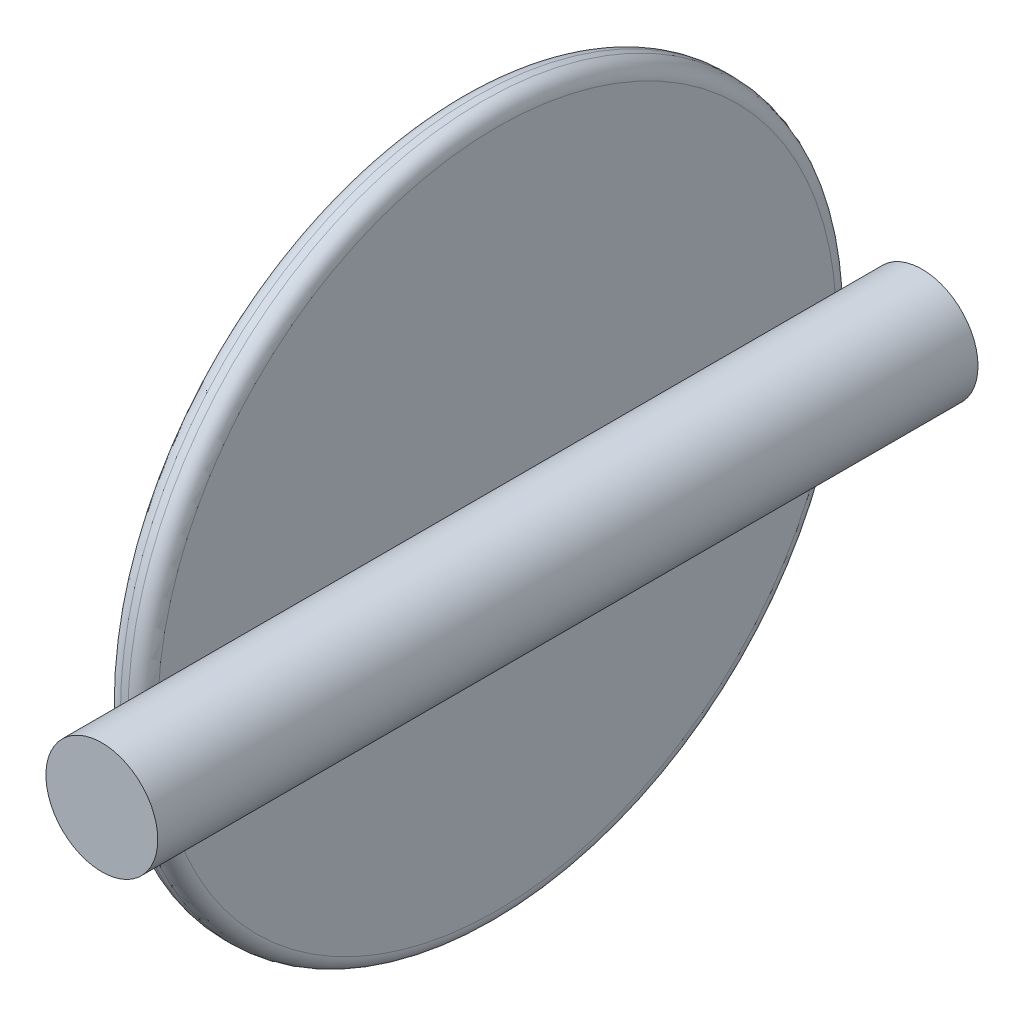
ISO-10303-21;
HEADER;
FILE_DESCRIPTION(('STEP AP214'),'2;1');
FILE_NAME('part.step','',(''),(''),'','','');
FILE_SCHEMA(('AUTOMOTIVE_DESIGN { 1 0 10303 214 1 1 1 1 }'));
ENDSEC;
DATA;
#1=APPLICATION_CONTEXT('core data for automotive mechanical design processes');
#2=APPLICATION_PROTOCOL_DEFINITION('international standard','automotive_design',2000,#1);
#3=PRODUCT_CONTEXT('',#1,'mechanical');
#4=PRODUCT('Part','Part','',(#3));
#5=PRODUCT_RELATED_PRODUCT_CATEGORY('part','',(#4));
#6=PRODUCT_DEFINITION_FORMATION('','',#4);
#7=PRODUCT_DEFINITION_CONTEXT('part definition',#1,'design');
#8=PRODUCT_DEFINITION('design','',#6,#7);
#9=PRODUCT_DEFINITION_SHAPE('','',#8);
#10=(LENGTH_UNIT() NAMED_UNIT(*) SI_UNIT(.MILLI.,.METRE.));
#11=(NAMED_UNIT(*) PLANE_ANGLE_UNIT() SI_UNIT($,.RADIAN.));
#12=(NAMED_UNIT(*) SI_UNIT($,.STERADIAN.) SOLID_ANGLE_UNIT());
#13=UNCERTAINTY_MEASURE_WITH_UNIT(LENGTH_MEASURE(1.E-05),#10,'distance_accuracy_value','');
#14=(GEOMETRIC_REPRESENTATION_CONTEXT(3) GLOBAL_UNCERTAINTY_ASSIGNED_CONTEXT((#13)) GLOBAL_UNIT_ASSIGNED_CONTEXT((#10,
#11,#12)) REPRESENTATION_CONTEXT('',''));
#15=CARTESIAN_POINT('',(0.,0.,0.));
#16=DIRECTION('',(0.,0.,1.));
#17=DIRECTION('',(1.,0.,0.));
#18=AXIS2_PLACEMENT_3D('',#15,#16,#17);
#19=CARTESIAN_POINT('',(5.,0.,0.));
#20=DIRECTION('',(1.,0.,0.));
#21=DIRECTION('',(0.,0.,-1.));
#22=AXIS2_PLACEMENT_3D('',#19,#20,#21);
#23=PLANE('',#22);
#24=DIRECTION('',(0.,0.,1.));
#25=VECTOR('',#24,1.);
#26=CARTESIAN_POINT('',(5.,2.69258240356725,-50.));
#27=LINE('',#26,#25);
#28=CARTESIAN_POINT('',(5.,2.69258240356725,-45.4202597967031));
#29=VERTEX_POINT('',#28);
#30=CARTESIAN_POINT('',(5.,2.69258240356725,45.4202597967031));
#31=VERTEX_POINT('',#30);
#32=EDGE_CURVE('E76',#29,#31,#27,.T.);
#33=ORIENTED_EDGE('',*,*,#32,.F.);
#34=CARTESIAN_POINT('',(5.,0.,0.));
#35=DIRECTION('',(1.,0.,0.));
#36=DIRECTION('',(0.,0.,-1.));
#37=AXIS2_PLACEMENT_3D('',#34,#35,#36);
#38=CIRCLE('',#37,45.5);
#39=EDGE_CURVE('E70',#29,#31,#38,.T.);
#40=ORIENTED_EDGE('',*,*,#39,.T.);
#41=EDGE_LOOP('',(#33,#40));
#42=FACE_BOUND('',#41,.T.);
#43=ADVANCED_FACE('F37',(#42),#23,.T.);
#44=CARTESIAN_POINT('',(5.,0.,0.));
#45=DIRECTION('',(-1.,0.,0.));
#46=DIRECTION('',(0.,0.,1.));
#47=AXIS2_PLACEMENT_3D('',#44,#45,#46);
#48=CYLINDRICAL_SURFACE('',#47,47.5);
#49=CARTESIAN_POINT('',(2.,0.,0.));
#50=DIRECTION('',(1.,0.,0.));
#51=DIRECTION('',(0.,0.,-1.));
#52=AXIS2_PLACEMENT_3D('',#49,#50,#51);
#53=CIRCLE('',#52,47.5);
#54=CARTESIAN_POINT('',(2.,0.,-47.5));
#55=VERTEX_POINT('',#54);
#56=EDGE_CURVE('E117',#55,#55,#53,.T.);
#57=ORIENTED_EDGE('',*,*,#56,.T.);
#58=EDGE_LOOP('',(#57));
#59=FACE_BOUND('',#58,.T.);
#60=CARTESIAN_POINT('',(3.,0.,0.));
#61=DIRECTION('',(1.,0.,0.));
#62=DIRECTION('',(0.,0.,-1.));
#63=AXIS2_PLACEMENT_3D('',#60,#61,#62);
#64=CIRCLE('',#63,47.5);
#65=CARTESIAN_POINT('',(3.,0.,-47.5));
#66=VERTEX_POINT('',#65);
#67=EDGE_CURVE('E114',#66,#66,#64,.F.);
#68=ORIENTED_EDGE('',*,*,#67,.T.);
#69=EDGE_LOOP('',(#68));
#70=FACE_BOUND('',#69,.T.);
#71=ADVANCED_FACE('F96',(#59,#70),#48,.T.);
#72=DIRECTION('',(0.,0.,1.));
#73=VECTOR('',#72,1.);
#74=CARTESIAN_POINT('',(5.,-2.69258240356725,-50.));
#75=LINE('',#74,#73);
#76=CARTESIAN_POINT('',(5.,-2.69258240356725,45.4202597967031));
#77=VERTEX_POINT('',#76);
#78=CARTESIAN_POINT('',(5.,-2.69258240356725,-45.4202597967031));
#79=VERTEX_POINT('',#78);
#80=EDGE_CURVE('E73',#77,#79,#75,.F.);
#81=ORIENTED_EDGE('',*,*,#80,.F.);
#82=EDGE_CURVE('E65',#77,#79,#38,.T.);
#83=ORIENTED_EDGE('',*,*,#82,.T.);
#84=EDGE_LOOP('',(#81,#83));
#85=FACE_BOUND('',#84,.T.);
#86=ADVANCED_FACE('F74',(#85),#23,.T.);
#87=CARTESIAN_POINT('',(0.,0.,0.));
#88=DIRECTION('',(1.,0.,0.));
#89=DIRECTION('',(0.,0.,-1.));
#90=AXIS2_PLACEMENT_3D('',#87,#88,#89);
#91=PLANE('',#90);
#92=CARTESIAN_POINT('',(0.,0.,0.));
#93=DIRECTION('',(1.,0.,0.));
#94=DIRECTION('',(0.,0.,-1.));
#95=AXIS2_PLACEMENT_3D('',#92,#93,#94);
#96=CIRCLE('',#95,45.5);
#97=CARTESIAN_POINT('',(0.,0.,-45.5));
#98=VERTEX_POINT('',#97);
#99=EDGE_CURVE('E71',#98,#98,#96,.F.);
#100=ORIENTED_EDGE('',*,*,#99,.T.);
#101=EDGE_LOOP('',(#100));
#102=FACE_BOUND('',#101,.T.);
#103=ADVANCED_FACE('F95',(#102),#91,.F.);
#104=CARTESIAN_POINT('',(2.,0.,0.));
#105=DIRECTION('',(1.,0.,0.));
#106=DIRECTION('',(0.,0.,-1.));
#107=AXIS2_PLACEMENT_3D('',#104,#105,#106);
#108=TOROIDAL_SURFACE('',#107,45.5,2.);
#109=ORIENTED_EDGE('',*,*,#99,.F.);
#110=EDGE_LOOP('',(#109));
#111=FACE_BOUND('',#110,.T.);
#112=ORIENTED_EDGE('',*,*,#56,.F.);
#113=EDGE_LOOP('',(#112));
#114=FACE_BOUND('',#113,.T.);
#115=ADVANCED_FACE('F99',(#111,#114),#108,.T.);
#116=CARTESIAN_POINT('',(3.,0.,0.));
#117=DIRECTION('',(1.,0.,0.));
#118=DIRECTION('',(0.,0.,-1.));
#119=AXIS2_PLACEMENT_3D('',#116,#117,#118);
#120=TOROIDAL_SURFACE('',#119,45.5,2.);
#121=CARTESIAN_POINT('',(4.88886670949522,-2.38364916140664,-46.0958169322206));
#122=CARTESIAN_POINT('',(4.87439027776899,-2.34045880890218,-46.1397043368997));
#123=CARTESIAN_POINT('',(4.85941368059871,-2.29446146020744,-46.1806952533402));
#124=CARTESIAN_POINT('',(4.8292253982599,-2.19830479491528,-46.2574250900848));
#125=CARTESIAN_POINT('',(4.81401335767839,-2.14813855665195,-46.2931549914539));
#126=CARTESIAN_POINT('',(4.78379598562867,-2.04434333399754,-46.3601158931499));
#127=CARTESIAN_POINT('',(4.76879273061351,-1.99069334255569,-46.3913150423144));
#128=CARTESIAN_POINT('',(4.73947243028143,-1.88094989520149,-46.4494698995618));
#129=CARTESIAN_POINT('',(4.72515575079399,-1.82485516638106,-46.4764233625029));
#130=CARTESIAN_POINT('',(4.69073892817864,-1.6829478296065,-46.5387680032836));
#131=CARTESIAN_POINT('',(4.67122321549962,-1.59598335863659,-46.5718638079663));
#132=CARTESIAN_POINT('',(4.6349247123901,-1.41909728802399,-46.6309101601054));
#133=CARTESIAN_POINT('',(4.61814365513574,-1.32917385609685,-46.6568561832985));
#134=CARTESIAN_POINT('',(4.5877051772404,-1.14733401534353,-46.7024845955994));
#135=CARTESIAN_POINT('',(4.57404501675976,-1.05541943277912,-46.7221724847209));
#136=CARTESIAN_POINT('',(4.55006115338336,-0.870140944396366,-46.7559885917435));
#137=CARTESIAN_POINT('',(4.53973815776916,-0.776776735731602,-46.7701156312114));
#138=CARTESIAN_POINT('',(4.51969234937144,-0.557532673232738,-46.7971783281872));
#139=CARTESIAN_POINT('',(4.51133878165695,-0.431276669295643,-46.8081157349512));
#140=CARTESIAN_POINT('',(4.50104106768368,-0.178019834407542,-46.8215491083663));
#141=CARTESIAN_POINT('',(4.49909968454028,-0.0510187059784462,-46.8240414359065));
#142=CARTESIAN_POINT('',(4.50166850483986,0.202824804713404,-46.8207155300848));
#143=CARTESIAN_POINT('',(4.50617945464702,0.329667166912347,-46.8148963352998));
#144=CARTESIAN_POINT('',(4.52156501894892,0.582234400368782,-46.7946176130067));
#145=CARTESIAN_POINT('',(4.5324364207162,0.70795980328905,-46.7801624475351));
#146=CARTESIAN_POINT('',(4.55555826059989,0.914968310298082,-46.7482762944432));
#147=CARTESIAN_POINT('',(4.56609068628794,0.99686342293789,-46.7335170162426));
#148=CARTESIAN_POINT('',(4.58969028245201,1.15932797736738,-46.6994606748165));
#149=CARTESIAN_POINT('',(4.60275685994132,1.23989772451468,-46.6801646729519));
#150=CARTESIAN_POINT('',(4.63121006427208,1.39909208898245,-46.6365577159121));
#151=CARTESIAN_POINT('',(4.64659215190892,1.47772016913644,-46.6122565390347));
#152=CARTESIAN_POINT('',(4.67940265413842,1.6325164089193,-46.5579512604025));
#153=CARTESIAN_POINT('',(4.69683004712296,1.7086857726127,-46.5279500011824));
#154=CARTESIAN_POINT('',(4.7365038538628,1.87075753893548,-46.4555593635942));
#155=CARTESIAN_POINT('',(4.75906037066363,1.95603701378379,-46.4119215809542));
#156=CARTESIAN_POINT('',(4.80532564100293,2.11987378673725,-46.3137954293131));
#157=CARTESIAN_POINT('',(4.82903325992731,2.19843750165343,-46.2593175873142));
#158=CARTESIAN_POINT('',(4.8688238887586,2.32364163554475,-46.1552980973587));
#159=CARTESIAN_POINT('',(4.885104241167,2.3728878267128,-46.1089930062998));
#160=CARTESIAN_POINT('',(4.91617664389263,2.46409217751475,-46.0091991775063));
#161=CARTESIAN_POINT('',(4.9309712171316,2.50606278256919,-45.9557229900902));
#162=CARTESIAN_POINT('',(4.95375942493033,2.56929787577563,-45.8575858872832));
#163=CARTESIAN_POINT('',(4.96249251052603,2.5930601669019,-45.8147176265175));
#164=CARTESIAN_POINT('',(4.97766403401201,2.63387029048972,-45.7254985663434));
#165=CARTESIAN_POINT('',(4.98410557080819,2.65092719408358,-45.6791525735029));
#166=CARTESIAN_POINT('',(4.99318246926168,2.67481718589924,-45.5913131531156));
#167=CARTESIAN_POINT('',(4.99625453241061,2.68282927227581,-45.5501889961402));
#168=CARTESIAN_POINT('',(4.99987844667771,2.69227151586694,-45.4670779164638));
#169=CARTESIAN_POINT('',(5.00043192070534,2.6937059115688,-45.4250915668643));
#170=CARTESIAN_POINT('',(4.99888365063803,2.68967922498038,-45.3414105686173));
#171=CARTESIAN_POINT('',(4.99677654599103,2.68420422159769,-45.2997166796161));
#172=CARTESIAN_POINT('',(4.99005558872057,2.66660192637399,-45.2179706074214));
#173=CARTESIAN_POINT('',(4.98544076131541,2.65447204768605,-45.1779190691443));
#174=CARTESIAN_POINT('',(4.97422333954149,2.62463470488913,-45.1012416000169));
#175=CARTESIAN_POINT('',(4.9676631378016,2.60704585292199,-45.0645625191627));
#176=CARTESIAN_POINT('',(4.95300451192217,2.56715945529446,-44.994226587648));
#177=CARTESIAN_POINT('',(4.94490553882366,2.54486022888264,-44.9605708218899));
#178=CARTESIAN_POINT('',(4.9222044482013,2.48123835170974,-44.876233031904));
#179=CARTESIAN_POINT('',(4.90671693891433,2.43677441600404,-44.8281625874534));
#180=CARTESIAN_POINT('',(4.87453690039382,2.34101353453012,-44.7398451683281));
#181=CARTESIAN_POINT('',(4.85784084142193,2.2896961705694,-44.6996224914492));
#182=CARTESIAN_POINT('',(4.82675795788027,2.19018678480025,-44.6312702568872));
#183=CARTESIAN_POINT('',(4.81238323389762,2.1426014562838,-44.6022336866361));
#184=CARTESIAN_POINT('',(4.78399107198041,2.04494757367393,-44.548446645062));
#185=CARTESIAN_POINT('',(4.76997391193912,1.99487717219864,-44.5236994257052));
#186=CARTESIAN_POINT('',(4.72889931378074,1.84179734415304,-44.4548876280278));
#187=CARTESIAN_POINT('',(4.70285681034736,1.73603912337648,-44.4163294729769));
#188=CARTESIAN_POINT('',(4.65569190551432,1.52400893682892,-44.3512353324164));
#189=CARTESIAN_POINT('',(4.63443539294849,1.41786934854785,-44.324344285116));
#190=CARTESIAN_POINT('',(4.59631284632482,1.20304698503818,-44.2784545301053));
#191=CARTESIAN_POINT('',(4.57945078933539,1.09436200244291,-44.2594629623794));
#192=CARTESIAN_POINT('',(4.55042406510939,0.87525172703931,-44.2278596222566));
#193=CARTESIAN_POINT('',(4.53826883564312,0.76482339505483,-44.2152606522798));
#194=CARTESIAN_POINT('',(4.51885741555933,0.543046678207608,-44.1955353583451));
#195=CARTESIAN_POINT('',(4.51160194034479,0.431698161392005,-44.1884098335327));
#196=CARTESIAN_POINT('',(4.50159703184707,0.197521464055511,-44.1786411325407));
#197=CARTESIAN_POINT('',(4.49936564297472,0.0746496110230458,-44.1765123745426));
#198=CARTESIAN_POINT('',(4.50094417440222,-0.171057220360097,-44.1780350573796));
#199=CARTESIAN_POINT('',(4.50475598767149,-0.293892175097063,-44.1816883093678));
#200=CARTESIAN_POINT('',(4.518357710423,-0.538500083432552,-44.1950820124198));
#201=CARTESIAN_POINT('',(4.52812794912347,-0.660275199808228,-44.2048024361611));
#202=CARTESIAN_POINT('',(4.55349376709008,-0.902411396100078,-44.2311749379207));
#203=CARTESIAN_POINT('',(4.56908577924087,-1.02277329543832,-44.2478227720913));
#204=CARTESIAN_POINT('',(4.60338165569014,-1.24538338444587,-44.2868482513165));
#205=CARTESIAN_POINT('',(4.6213991705288,-1.34791798173951,-44.3081740143866));
#206=CARTESIAN_POINT('',(4.66127750883198,-1.55042539042333,-44.3588536383493));
#207=CARTESIAN_POINT('',(4.68314405560835,-1.65039412927364,-44.3882194910691));
#208=CARTESIAN_POINT('',(4.73027678238904,-1.84699177537602,-44.4576506521148));
#209=CARTESIAN_POINT('',(4.75557218549631,-1.94358184452139,-44.4978112229425));
#210=CARTESIAN_POINT('',(4.79479885271602,-2.08264571343193,-44.5684926061015));
#211=CARTESIAN_POINT('',(4.80807148136808,-2.12797871700693,-44.5937562528269));
#212=CARTESIAN_POINT('',(4.83473356510242,-2.21609230959943,-44.6483147806241));
#213=CARTESIAN_POINT('',(4.84812290561305,-2.25887513581612,-44.6776060514807));
#214=CARTESIAN_POINT('',(4.87465584916753,-2.3412285103297,-44.740959112864));
#215=CARTESIAN_POINT('',(4.88779800261632,-2.38078302695233,-44.7750426639778));
#216=CARTESIAN_POINT('',(4.91313616152098,-2.45517906873478,-44.8484272797633));
#217=CARTESIAN_POINT('',(4.92533191803068,-2.49001935561442,-44.8877297099202));
#218=CARTESIAN_POINT('',(4.94804106889106,-2.55363105346753,-44.9723472070432));
#219=CARTESIAN_POINT('',(4.95853092241555,-2.58231904515013,-45.0177328176284));
#220=CARTESIAN_POINT('',(4.9764922830929,-2.63078250403476,-45.1135852053055));
#221=CARTESIAN_POINT('',(4.98397016539054,-2.65057680601333,-45.1640409648509));
#222=CARTESIAN_POINT('',(4.99424157300664,-2.67759889467718,-45.2621399268391));
#223=CARTESIAN_POINT('',(4.99748882463726,-2.68604769130948,-45.3093963690516));
#224=CARTESIAN_POINT('',(5.00051196517696,-2.69391681747868,-45.4047591414615));
#225=CARTESIAN_POINT('',(5.00028917423495,-2.69334058051423,-45.4528651414946));
#226=CARTESIAN_POINT('',(4.99681234363959,-2.68428315388154,-45.5407727642514));
#227=CARTESIAN_POINT('',(4.99402271922748,-2.67701296650029,-45.5807282225424));
#228=CARTESIAN_POINT('',(4.98637555041799,-2.65691310376204,-45.6590044462145));
#229=CARTESIAN_POINT('',(4.98151671736917,-2.64407996384792,-45.6973241765154));
#230=CARTESIAN_POINT('',(4.96764002254316,-2.60700105549166,-45.7880392071095));
#231=CARTESIAN_POINT('',(4.95773259887435,-2.58021860096965,-45.8392574786128));
#232=CARTESIAN_POINT('',(4.93567994605811,-2.51921179498245,-45.9364243564021));
#233=CARTESIAN_POINT('',(4.92353307142044,-2.48498196802927,-45.9823690472562));
#234=CARTESIAN_POINT('',(4.90363660312084,-2.42736673899825,-46.0498707732013));
#235=CARTESIAN_POINT('',(4.89631791047382,-2.40587977755112,-46.0732275345791));
#236=CARTESIAN_POINT('',(4.88886670949522,-2.38364916140664,-46.0958169322206));
#237=B_SPLINE_CURVE_WITH_KNOTS('',3,(#121,#122,#123,#124,#125,#126,#127,#128,#129,#130,#131,
#132,#133,#134,#135,#136,#137,#138,#139,#140,#141,#142,#143,#144,#145,#146,#147,#148,#149,#150,
#151,#152,#153,#154,#155,#156,#157,#158,#159,#160,#161,#162,#163,#164,#165,#166,#167,#168,#169,
#170,#171,#172,#173,#174,#175,#176,#177,#178,#179,#180,#181,#182,#183,#184,#185,#186,#187,#188,
#189,#190,#191,#192,#193,#194,#195,#196,#197,#198,#199,#200,#201,#202,#203,#204,#205,#206,#207,
#208,#209,#210,#211,#212,#213,#214,#215,#216,#217,#218,#219,#220,#221,#222,#223,#224,#225,#226,
#227,#228,#229,#230,#231,#232,#233,#234,#235,#236),.UNSPECIFIED.,.T.,.F.,(4,2,2,2,2,2,2,2,2,2,2,
2,2,2,2,2,2,2,2,2,2,2,2,2,2,2,2,2,2,2,2,2,2,2,2,2,2,2,2,2,2,2,2,2,2,2,2,2,2,2,2,2,2,2,2,2,2,4),
(0.,0.189723463225722,0.379768473710749,0.571090779122139,0.762513919600919,1.04728909437029,
1.33224405850073,1.61694789067907,1.90171202372926,2.28223843225774,2.66292879447133,
3.04366319604712,3.42420545072514,3.67569314627386,3.92712206502775,4.17806436436346,
4.42888184993345,4.72349624922837,5.01782592668,5.22585167275529,5.43351798686248,
5.58237098002969,5.73102190427416,5.85650814288717,5.98191351016365,6.10757194867855,
6.23327926710116,6.35642668122228,6.47961811113993,6.68032368834128,6.88164114647993,
7.05409663450955,7.22668230293219,7.57229060308487,7.90648215736291,8.24097511940317,
8.576135350417,8.91134450690865,9.27978648171567,9.64834388989467,10.0156911026012,
10.3828136028035,10.7012775848464,11.0202191694313,11.3420734538497,11.5026120651798,
11.6630077024146,11.8241567063449,11.9853479572286,12.1486031380072,12.3115109334033,
12.4549100775619,12.5982546680393,12.7198794302234,12.8415800482944,13.0165275316536,
13.191604077923,13.2892571240317),.UNSPECIFIED.);
#238=EDGE_CURVE('E11',#79,#29,#237,.T.);
#239=ORIENTED_EDGE('',*,*,#238,.F.);
#240=ORIENTED_EDGE('',*,*,#82,.F.);
#241=CARTESIAN_POINT('',(4.89227773796923,-2.39380121268082,44.7885530367299));
#242=CARTESIAN_POINT('',(4.87783493096522,-2.35091497462344,44.748573984033));
#243=CARTESIAN_POINT('',(4.86288052874775,-2.30521412209422,44.7117883572214));
#244=CARTESIAN_POINT('',(4.8327742455579,-2.20983933422314,44.643809879476));
#245=CARTESIAN_POINT('',(4.81762202432393,-2.16015749399031,44.6126285757125));
#246=CARTESIAN_POINT('',(4.78757182754306,-2.05760922700455,44.5548789179999));
#247=CARTESIAN_POINT('',(4.7726766422758,-2.00472155330981,44.528347242986));
#248=CARTESIAN_POINT('',(4.74361777846598,-1.89685155303882,44.4794386616671));
#249=CARTESIAN_POINT('',(4.72945457744664,-1.84186789875129,44.4570644434615));
#250=CARTESIAN_POINT('',(4.69345621425263,-1.69504826971792,44.402802644543));
#251=CARTESIAN_POINT('',(4.67244166215025,-1.60192226108462,44.3738617340901));
#252=CARTESIAN_POINT('',(4.63367714208266,-1.41301645329545,44.323339685839));
#253=CARTESIAN_POINT('',(4.61593003433189,-1.31723441271898,44.3017649821974));
#254=CARTESIAN_POINT('',(4.58405449371797,-1.12398291325426,44.2645762680746));
#255=CARTESIAN_POINT('',(4.56992466168776,-1.02651412242514,44.2489599517316));
#256=CARTESIAN_POINT('',(4.54546102412434,-0.830434105930235,44.2226955648485));
#257=CARTESIAN_POINT('',(4.5351281328472,-0.731822611004054,44.2120486907218));
#258=CARTESIAN_POINT('',(4.51425677422111,-0.485334460142732,44.190898197953));
#259=CARTESIAN_POINT('',(4.50610413011039,-0.337021387983734,44.183027089649));
#260=CARTESIAN_POINT('',(4.49863185519678,-0.0398833194917441,44.1757975510269));
#261=CARTESIAN_POINT('',(4.499318587014,0.108941968494744,44.1764452525915));
#262=CARTESIAN_POINT('',(4.50950853700327,0.405583049619136,44.1863482488143));
#263=CARTESIAN_POINT('',(4.51898633150061,0.553400516141809,44.1955787223623));
#264=CARTESIAN_POINT('',(4.54654568490609,0.847194402588586,44.2237933655239));
#265=CARTESIAN_POINT('',(4.56461814023281,0.993172603139701,44.2427672165127));
#266=CARTESIAN_POINT('',(4.60260560961128,1.24076122075081,44.2859459766862));
#267=CARTESIAN_POINT('',(4.62053951058929,1.34319751519157,44.3071346797845));
#268=CARTESIAN_POINT('',(4.66023836710461,1.54548732721774,44.3574820081989));
#269=CARTESIAN_POINT('',(4.68200716994093,1.64533813447584,44.3866486536429));
#270=CARTESIAN_POINT('',(4.72894747967386,1.84174597951931,44.4555918174185));
#271=CARTESIAN_POINT('',(4.75414819127243,1.9382647026214,44.495462613693));
#272=CARTESIAN_POINT('',(4.79325917127114,2.07731121158022,44.5656205446736));
#273=CARTESIAN_POINT('',(4.80649903958984,2.12265754519192,44.5906982034243));
#274=CARTESIAN_POINT('',(4.83310978839988,2.21083589587832,44.6448500275147));
#275=CARTESIAN_POINT('',(4.8464805452278,2.2536700607341,44.6739207057898));
#276=CARTESIAN_POINT('',(4.87307467280623,2.33641676045602,44.7369731745639));
#277=CARTESIAN_POINT('',(4.8862950547273,2.37629418936014,44.7710029957788));
#278=CARTESIAN_POINT('',(4.91180992894896,2.45135305825972,44.8443062437025));
#279=CARTESIAN_POINT('',(4.9241041854753,2.48653330418906,44.8835809986646));
#280=CARTESIAN_POINT('',(4.94703052741471,2.5508435842649,44.9681913762449));
#281=CARTESIAN_POINT('',(4.9576391924854,2.57988995380376,45.0135984759963));
#282=CARTESIAN_POINT('',(4.97584553632962,2.62905889547447,45.1095650927629));
#283=CARTESIAN_POINT('',(4.98344967915892,2.6492006366317,45.1601132509891));
#284=CARTESIAN_POINT('',(4.99394723788902,2.67683026840491,45.2584785396378));
#285=CARTESIAN_POINT('',(4.99729505567756,2.68554282514977,45.3058999965932));
#286=CARTESIAN_POINT('',(5.00049065207264,2.69386187351659,45.4016505976741));
#287=CARTESIAN_POINT('',(5.00033950843271,2.69347116913372,45.4499794577175));
#288=CARTESIAN_POINT('',(4.99696692605714,2.68468613527978,45.538153996053));
#289=CARTESIAN_POINT('',(4.99422494347985,2.677541569813,45.5781536142516));
#290=CARTESIAN_POINT('',(4.98666488299353,2.65767632114363,45.65651639076));
#291=CARTESIAN_POINT('',(4.981846339445,2.64495438728375,45.6948791799123));
#292=CARTESIAN_POINT('',(4.96808853999783,2.60820799802931,45.7855008225725));
#293=CARTESIAN_POINT('',(4.95826838504675,2.58167512549478,45.8366066775983));
#294=CARTESIAN_POINT('',(4.93637175627556,2.52114990427271,45.9336519557973));
#295=CARTESIAN_POINT('',(4.92429007175772,2.4871402965257,45.9795790471405));
#296=CARTESIAN_POINT('',(4.89215038638512,2.39415424854409,46.0891611144244));
#297=CARTESIAN_POINT('',(4.87124528362176,2.33146798915085,46.1493970654572));
#298=CARTESIAN_POINT('',(4.82886005452134,2.19766137583519,46.2592907496798));
#299=CARTESIAN_POINT('',(4.80737876533019,2.12652278748284,46.3089249420772));
#300=CARTESIAN_POINT('',(4.76849086940203,1.98985863479052,46.3922703930399));
#301=CARTESIAN_POINT('',(4.75096215445141,1.9251295952216,46.4272555001233));
#302=CARTESIAN_POINT('',(4.71705934701234,1.79261177864166,46.4915948025264));
#303=CARTESIAN_POINT('',(4.70068604146879,1.7248209668388,46.5209451830249));
#304=CARTESIAN_POINT('',(4.66946133377051,1.58688738256904,46.5747243185682));
#305=CARTESIAN_POINT('',(4.65461194510391,1.51674165691011,46.5991466024404));
#306=CARTESIAN_POINT('',(4.62670972925008,1.37471270899079,46.6435916290814));
#307=CARTESIAN_POINT('',(4.61365745657931,1.30282895845452,46.6636130150447));
#308=CARTESIAN_POINT('',(4.58276802044256,1.11706137468508,46.7098307224321));
#309=CARTESIAN_POINT('',(4.56635194199857,1.00222935241187,46.7331940227982));
#310=CARTESIAN_POINT('',(4.53877255139195,0.770532240499283,46.7715500616421));
#311=CARTESIAN_POINT('',(4.52761209691766,0.653666080546647,46.7865382470667));
#312=CARTESIAN_POINT('',(4.51075812109919,0.418543944271331,46.8089173452071));
#313=CARTESIAN_POINT('',(4.50507758398331,0.30028533582793,46.8162902169481));
#314=CARTESIAN_POINT('',(4.49933282054265,0.0634352762439584,46.8237453608161));
#315=CARTESIAN_POINT('',(4.49926731521841,-0.0551560929452533,46.8238292932277));
#316=CARTESIAN_POINT('',(4.50482613011356,-0.295268214339401,46.8166176272107));
#317=CARTESIAN_POINT('',(4.51060768971383,-0.416779383792992,46.8091180948661));
#318=CARTESIAN_POINT('',(4.52799556643148,-0.658677482895437,46.7860280422952));
#319=CARTESIAN_POINT('',(4.53960437169163,-0.779063909911488,46.7704340657708));
#320=CARTESIAN_POINT('',(4.56832437088586,-1.01710256914523,46.7304055335262));
#321=CARTESIAN_POINT('',(4.58540848781009,-1.13476526310362,46.7060144093578));
#322=CARTESIAN_POINT('',(4.62461883110592,-1.36657601098317,46.6470523319952));
#323=CARTESIAN_POINT('',(4.64673918884504,-1.48072798151667,46.6124932137716));
#324=CARTESIAN_POINT('',(4.69011456977444,-1.68039593517168,46.539675458355));
#325=CARTESIAN_POINT('',(4.71058380292834,-1.7669096439034,46.5037004756059));
#326=CARTESIAN_POINT('',(4.75348363147986,-1.93534161785451,46.4226378169541));
#327=CARTESIAN_POINT('',(4.77591760437495,-2.01725155587768,46.3775342669142));
#328=CARTESIAN_POINT('',(4.82182757226836,-2.17500999570333,46.2758790187767));
#329=CARTESIAN_POINT('',(4.84531318660786,-2.25076823638717,46.2191891158608));
#330=CARTESIAN_POINT('',(4.89091573099505,-2.39087318602365,46.0926821304848));
#331=CARTESIAN_POINT('',(4.91303871470109,-2.45527315934052,46.0229296647352));
#332=CARTESIAN_POINT('',(4.94274803164545,-2.53892282388668,45.906561008387));
#333=CARTESIAN_POINT('',(4.95216372567492,-2.56487924731974,45.8652403831979));
#334=CARTESIAN_POINT('',(4.96901022773721,-2.61070353692563,45.7789176136654));
#335=CARTESIAN_POINT('',(4.97644172495513,-2.63057351749968,45.7339167547166));
#336=CARTESIAN_POINT('',(4.98863050929636,-2.66289442027114,45.6403306802975));
#337=CARTESIAN_POINT('',(4.99335659039613,-2.67525886326968,45.5917106729709));
#338=CARTESIAN_POINT('',(4.99928885941489,-2.69074695891745,45.4928148793724));
#339=CARTESIAN_POINT('',(5.00050048107523,-2.69388487689347,45.4425417708336));
#340=CARTESIAN_POINT('',(4.99920875745043,-2.6905241125321,45.3492495193425));
#341=CARTESIAN_POINT('',(4.99718894514375,-2.68527980477489,45.3061750327785));
#342=CARTESIAN_POINT('',(4.99046892373668,-2.66768834873747,45.221718930195));
#343=CARTESIAN_POINT('',(4.98576794200591,-2.65533915303859,45.1803378058357));
#344=CARTESIAN_POINT('',(4.97442179840459,-2.62516546076204,45.1024299216522));
#345=CARTESIAN_POINT('',(4.9678884817551,-2.60765361629214,45.0657631016248));
#346=CARTESIAN_POINT('',(4.95328172554566,-2.56791897702659,44.9954412661335));
#347=CARTESIAN_POINT('',(4.94520815844396,-2.54569579208743,44.9617865004245));
#348=CARTESIAN_POINT('',(4.92975291468858,-2.50240311059765,44.904206864694));
#349=CARTESIAN_POINT('',(4.92256691095258,-2.48202562253347,44.8796989495753));
#350=CARTESIAN_POINT('',(4.90772931111259,-2.4393049746086,44.8326690431242));
#351=CARTESIAN_POINT('',(4.90007813972307,-2.41696359977536,44.8101452848772));
#352=CARTESIAN_POINT('',(4.89227773796923,-2.39380121268082,44.7885530367299));
#353=B_SPLINE_CURVE_WITH_KNOTS('',3,(#241,#242,#243,#244,#245,#246,#247,#248,#249,#250,#251,
#252,#253,#254,#255,#256,#257,#258,#259,#260,#261,#262,#263,#264,#265,#266,#267,#268,#269,#270,
#271,#272,#273,#274,#275,#276,#277,#278,#279,#280,#281,#282,#283,#284,#285,#286,#287,#288,#289,
#290,#291,#292,#293,#294,#295,#296,#297,#298,#299,#300,#301,#302,#303,#304,#305,#306,#307,#308,
#309,#310,#311,#312,#313,#314,#315,#316,#317,#318,#319,#320,#321,#322,#323,#324,#325,#326,#327,
#328,#329,#330,#331,#332,#333,#334,#335,#336,#337,#338,#339,#340,#341,#342,#343,#344,#345,#346,
#347,#348,#349,#350,#351,#352),.UNSPECIFIED.,.T.,.F.,(4,2,2,2,2,2,2,2,2,2,2,2,2,2,2,2,2,2,2,2,2,
2,2,2,2,2,2,2,2,2,2,2,2,2,2,2,2,2,2,2,2,2,2,2,2,2,2,2,2,2,2,2,2,2,2,4),(0.,0.181082172096524,
0.362533273179831,0.545356962196564,0.728298451849466,1.02707618165852,1.32611422100988,
1.62503641668552,1.92403054201265,2.36970131791081,2.81569290744393,3.26039870137104,
3.70463450246407,4.02270093596326,4.3410883004332,4.66237751965124,4.82266613469482,
4.98281565085317,5.14463442031651,5.30649424756205,5.47043654141403,5.63402417689712,
5.77805974938725,5.92205095648991,6.04372679731984,6.16542993644971,6.33968784104584,
6.51435230161663,6.78110098809743,7.04843596008175,7.27503404264592,7.50178499972474,
7.72883179724796,7.95594849586983,8.31042200288675,8.66508802910058,9.02059235910465,
9.37601571164151,9.74125813123879,10.1066566364642,10.4702753222268,10.8334724394924,
11.1207437839896,11.4085190392205,11.6999515008509,11.9899786897517,12.1386344943148,
12.2872385978384,12.4375239417843,12.5875768038593,12.7171911098276,12.8468427855289,
12.9698573721747,13.0928821495726,13.1907707170751,13.288571213365),.UNSPECIFIED.);
#354=EDGE_CURVE('E50',#31,#77,#353,.T.);
#355=ORIENTED_EDGE('',*,*,#354,.F.);
#356=ORIENTED_EDGE('',*,*,#39,.F.);
#357=EDGE_LOOP('',(#239,#240,#355,#356));
#358=FACE_BOUND('',#357,.T.);
#359=ORIENTED_EDGE('',*,*,#67,.F.);
#360=EDGE_LOOP('',(#359));
#361=FACE_BOUND('',#360,.T.);
#362=ADVANCED_FACE('F39',(#358,#361),#120,.T.);
#363=CARTESIAN_POINT('',(12.,0.,-50.));
#364=DIRECTION('',(0.,0.,1.));
#365=DIRECTION('',(1.,0.,0.));
#366=AXIS2_PLACEMENT_3D('',#363,#364,#365);
#367=CYLINDRICAL_SURFACE('',#366,7.5);
#368=ORIENTED_EDGE('',*,*,#80,.T.);
#369=ORIENTED_EDGE('',*,*,#238,.T.);
#370=ORIENTED_EDGE('',*,*,#32,.T.);
#371=ORIENTED_EDGE('',*,*,#354,.T.);
#372=EDGE_LOOP('',(#368,#369,#370,#371));
#373=FACE_BOUND('',#372,.T.);
#374=CARTESIAN_POINT('',(12.,0.,-50.));
#375=DIRECTION('',(0.,0.,1.));
#376=DIRECTION('',(1.,0.,0.));
#377=AXIS2_PLACEMENT_3D('',#374,#375,#376);
#378=CIRCLE('',#377,7.5);
#379=CARTESIAN_POINT('',(19.5,0.,-50.));
#380=VERTEX_POINT('',#379);
#381=EDGE_CURVE('E77',#380,#380,#378,.T.);
#382=ORIENTED_EDGE('',*,*,#381,.T.);
#383=EDGE_LOOP('',(#382));
#384=FACE_BOUND('',#383,.T.);
#385=CARTESIAN_POINT('',(12.,0.,60.));
#386=DIRECTION('',(0.,0.,1.));
#387=DIRECTION('',(1.,0.,0.));
#388=AXIS2_PLACEMENT_3D('',#385,#386,#387);
#389=CIRCLE('',#388,7.5);
#390=CARTESIAN_POINT('',(19.5,0.,60.));
#391=VERTEX_POINT('',#390);
#392=EDGE_CURVE('E128',#391,#391,#389,.T.);
#393=ORIENTED_EDGE('',*,*,#392,.F.);
#394=EDGE_LOOP('',(#393));
#395=FACE_BOUND('',#394,.T.);
#396=ADVANCED_FACE('F80',(#373,#384,#395),#367,.T.);
#397=CARTESIAN_POINT('',(12.,0.,-50.));
#398=DIRECTION('',(0.,0.,1.));
#399=DIRECTION('',(1.,0.,0.));
#400=AXIS2_PLACEMENT_3D('',#397,#398,#399);
#401=PLANE('',#400);
#402=ORIENTED_EDGE('',*,*,#381,.F.);
#403=EDGE_LOOP('',(#402));
#404=FACE_BOUND('',#403,.T.);
#405=ADVANCED_FACE('F90',(#404),#401,.F.);
#406=CARTESIAN_POINT('',(12.,0.,60.));
#407=DIRECTION('',(0.,0.,1.));
#408=DIRECTION('',(1.,0.,0.));
#409=AXIS2_PLACEMENT_3D('',#406,#407,#408);
#410=PLANE('',#409);
#411=ORIENTED_EDGE('',*,*,#392,.T.);
#412=EDGE_LOOP('',(#411));
#413=FACE_BOUND('',#412,.T.);
#414=ADVANCED_FACE('F132',(#413),#410,.T.);
#415=CLOSED_SHELL('',(#43,#71,#86,#103,#115,#362,#396,#405,#414));
#416=MANIFOLD_SOLID_BREP('B2',#415);
#417=ADVANCED_BREP_SHAPE_REPRESENTATION('',(#18,#416),#14);
#418=SHAPE_DEFINITION_REPRESENTATION(#9,#417);
ENDSEC;
END-ISO-10303-21;
